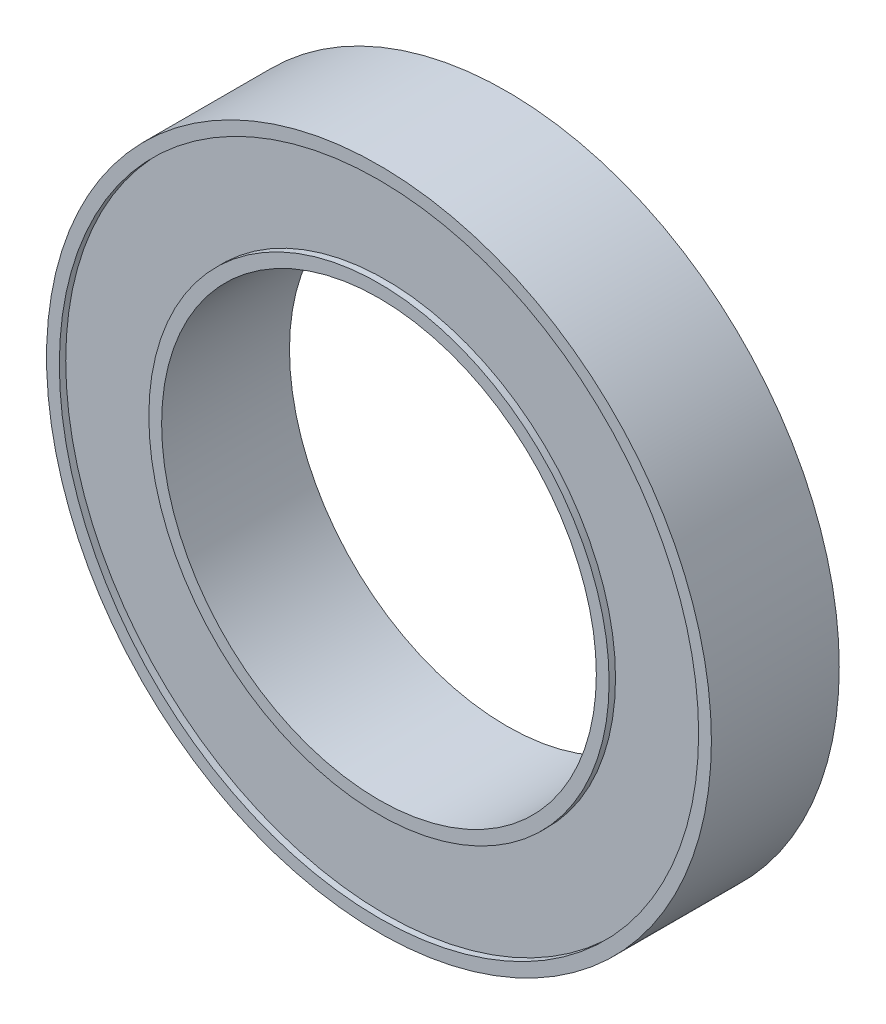
ISO-10303-21;
HEADER;
FILE_DESCRIPTION(('STEP AP214'),'2;1');
FILE_NAME('part.step','',(''),(''),'','','');
FILE_SCHEMA(('AUTOMOTIVE_DESIGN { 1 0 10303 214 1 1 1 1 }'));
ENDSEC;
DATA;
#1=APPLICATION_CONTEXT('core data for automotive mechanical design processes');
#2=APPLICATION_PROTOCOL_DEFINITION('international standard','automotive_design',2000,#1);
#3=PRODUCT_CONTEXT('',#1,'mechanical');
#4=PRODUCT('Part','Part','',(#3));
#5=PRODUCT_RELATED_PRODUCT_CATEGORY('part','',(#4));
#6=PRODUCT_DEFINITION_FORMATION('','',#4);
#7=PRODUCT_DEFINITION_CONTEXT('part definition',#1,'design');
#8=PRODUCT_DEFINITION('design','',#6,#7);
#9=PRODUCT_DEFINITION_SHAPE('','',#8);
#10=(LENGTH_UNIT() NAMED_UNIT(*) SI_UNIT(.MILLI.,.METRE.));
#11=(NAMED_UNIT(*) PLANE_ANGLE_UNIT() SI_UNIT($,.RADIAN.));
#12=(NAMED_UNIT(*) SI_UNIT($,.STERADIAN.) SOLID_ANGLE_UNIT());
#13=UNCERTAINTY_MEASURE_WITH_UNIT(LENGTH_MEASURE(1.E-05),#10,'distance_accuracy_value','');
#14=(GEOMETRIC_REPRESENTATION_CONTEXT(3) GLOBAL_UNCERTAINTY_ASSIGNED_CONTEXT((#13)) GLOBAL_UNIT_ASSIGNED_CONTEXT((#10,
#11,#12)) REPRESENTATION_CONTEXT('',''));
#15=CARTESIAN_POINT('',(0.,0.,0.));
#16=DIRECTION('',(0.,0.,1.));
#17=DIRECTION('',(1.,0.,0.));
#18=AXIS2_PLACEMENT_3D('',#15,#16,#17);
#19=CARTESIAN_POINT('',(0.,0.,-2.5));
#20=DIRECTION('',(0.,0.,1.));
#21=DIRECTION('',(1.,0.,0.));
#22=AXIS2_PLACEMENT_3D('',#19,#20,#21);
#23=PLANE('',#22);
#24=CARTESIAN_POINT('',(0.,0.,-2.5));
#25=DIRECTION('',(0.,0.,1.));
#26=DIRECTION('',(1.,0.,0.));
#27=AXIS2_PLACEMENT_3D('',#24,#25,#26);
#28=CIRCLE('',#27,8.5);
#29=CARTESIAN_POINT('',(8.5,0.,-2.5));
#30=VERTEX_POINT('',#29);
#31=EDGE_CURVE('E60',#30,#30,#28,.T.);
#32=ORIENTED_EDGE('',*,*,#31,.T.);
#33=EDGE_LOOP('',(#32));
#34=FACE_BOUND('',#33,.T.);
#35=CARTESIAN_POINT('',(0.,0.,-2.5));
#36=DIRECTION('',(0.,0.,1.));
#37=DIRECTION('',(1.,0.,0.));
#38=AXIS2_PLACEMENT_3D('',#35,#36,#37);
#39=CIRCLE('',#38,9.);
#40=CARTESIAN_POINT('',(9.,0.,-2.5));
#41=VERTEX_POINT('',#40);
#42=EDGE_CURVE('E84',#41,#41,#39,.T.);
#43=ORIENTED_EDGE('',*,*,#42,.F.);
#44=EDGE_LOOP('',(#43));
#45=FACE_BOUND('',#44,.T.);
#46=ADVANCED_FACE('F47',(#34,#45),#23,.F.);
#47=CARTESIAN_POINT('',(0.,0.,2.5));
#48=DIRECTION('',(0.,0.,1.));
#49=DIRECTION('',(1.,0.,0.));
#50=AXIS2_PLACEMENT_3D('',#47,#48,#49);
#51=PLANE('',#50);
#52=CARTESIAN_POINT('',(0.,0.,2.5));
#53=DIRECTION('',(0.,0.,1.));
#54=DIRECTION('',(1.,0.,0.));
#55=AXIS2_PLACEMENT_3D('',#52,#53,#54);
#56=CIRCLE('',#55,8.5);
#57=CARTESIAN_POINT('',(8.5,0.,2.5));
#58=VERTEX_POINT('',#57);
#59=EDGE_CURVE('E58',#58,#58,#56,.T.);
#60=ORIENTED_EDGE('',*,*,#59,.F.);
#61=EDGE_LOOP('',(#60));
#62=FACE_BOUND('',#61,.T.);
#63=CARTESIAN_POINT('',(0.,0.,2.5));
#64=DIRECTION('',(0.,0.,1.));
#65=DIRECTION('',(1.,0.,0.));
#66=AXIS2_PLACEMENT_3D('',#63,#64,#65);
#67=CIRCLE('',#66,9.);
#68=CARTESIAN_POINT('',(9.,0.,2.5));
#69=VERTEX_POINT('',#68);
#70=EDGE_CURVE('E72',#69,#69,#67,.T.);
#71=ORIENTED_EDGE('',*,*,#70,.T.);
#72=EDGE_LOOP('',(#71));
#73=FACE_BOUND('',#72,.T.);
#74=ADVANCED_FACE('F100',(#62,#73),#51,.T.);
#75=CARTESIAN_POINT('',(0.,0.,2.5));
#76=DIRECTION('',(0.,0.,1.));
#77=DIRECTION('',(1.,0.,0.));
#78=AXIS2_PLACEMENT_3D('',#75,#76,#77);
#79=CIRCLE('',#78,12.5);
#80=CARTESIAN_POINT('',(12.5,0.,2.5));
#81=VERTEX_POINT('',#80);
#82=EDGE_CURVE('E66',#81,#81,#79,.T.);
#83=ORIENTED_EDGE('',*,*,#82,.F.);
#84=EDGE_LOOP('',(#83));
#85=FACE_BOUND('',#84,.T.);
#86=CARTESIAN_POINT('',(0.,0.,2.5));
#87=DIRECTION('',(0.,0.,1.));
#88=DIRECTION('',(1.,0.,0.));
#89=AXIS2_PLACEMENT_3D('',#86,#87,#88);
#90=CIRCLE('',#89,13.);
#91=CARTESIAN_POINT('',(13.,0.,2.5));
#92=VERTEX_POINT('',#91);
#93=EDGE_CURVE('E11',#92,#92,#90,.T.);
#94=ORIENTED_EDGE('',*,*,#93,.T.);
#95=EDGE_LOOP('',(#94));
#96=FACE_BOUND('',#95,.T.);
#97=ADVANCED_FACE('F106',(#85,#96),#51,.T.);
#98=CARTESIAN_POINT('',(0.,0.,-2.5));
#99=DIRECTION('',(0.,0.,1.));
#100=DIRECTION('',(1.,0.,0.));
#101=AXIS2_PLACEMENT_3D('',#98,#99,#100);
#102=CIRCLE('',#101,12.5);
#103=CARTESIAN_POINT('',(12.5,0.,-2.5));
#104=VERTEX_POINT('',#103);
#105=EDGE_CURVE('E78',#104,#104,#102,.T.);
#106=ORIENTED_EDGE('',*,*,#105,.T.);
#107=EDGE_LOOP('',(#106));
#108=FACE_BOUND('',#107,.T.);
#109=CARTESIAN_POINT('',(0.,0.,-2.5));
#110=DIRECTION('',(0.,0.,1.));
#111=DIRECTION('',(1.,0.,0.));
#112=AXIS2_PLACEMENT_3D('',#109,#110,#111);
#113=CIRCLE('',#112,13.);
#114=CARTESIAN_POINT('',(13.,0.,-2.5));
#115=VERTEX_POINT('',#114);
#116=EDGE_CURVE('E51',#115,#115,#113,.T.);
#117=ORIENTED_EDGE('',*,*,#116,.F.);
#118=EDGE_LOOP('',(#117));
#119=FACE_BOUND('',#118,.T.);
#120=ADVANCED_FACE('F102',(#108,#119),#23,.F.);
#121=CARTESIAN_POINT('',(0.,0.,2.5));
#122=DIRECTION('',(0.,0.,-1.));
#123=DIRECTION('',(-1.,0.,0.));
#124=AXIS2_PLACEMENT_3D('',#121,#122,#123);
#125=CYLINDRICAL_SURFACE('',#124,13.);
#126=ORIENTED_EDGE('',*,*,#93,.F.);
#127=EDGE_LOOP('',(#126));
#128=FACE_BOUND('',#127,.T.);
#129=ORIENTED_EDGE('',*,*,#116,.T.);
#130=EDGE_LOOP('',(#129));
#131=FACE_BOUND('',#130,.T.);
#132=ADVANCED_FACE('F49',(#128,#131),#125,.T.);
#133=CARTESIAN_POINT('',(0.,0.,2.5));
#134=DIRECTION('',(0.,0.,-1.));
#135=DIRECTION('',(-1.,0.,0.));
#136=AXIS2_PLACEMENT_3D('',#133,#134,#135);
#137=CYLINDRICAL_SURFACE('',#136,8.5);
#138=ORIENTED_EDGE('',*,*,#59,.T.);
#139=EDGE_LOOP('',(#138));
#140=FACE_BOUND('',#139,.T.);
#141=ORIENTED_EDGE('',*,*,#31,.F.);
#142=EDGE_LOOP('',(#141));
#143=FACE_BOUND('',#142,.T.);
#144=ADVANCED_FACE('F115',(#140,#143),#137,.F.);
#145=CARTESIAN_POINT('',(0.,0.,2.25));
#146=DIRECTION('',(0.,0.,1.));
#147=DIRECTION('',(1.,0.,0.));
#148=AXIS2_PLACEMENT_3D('',#145,#146,#147);
#149=CYLINDRICAL_SURFACE('',#148,12.5);
#150=CARTESIAN_POINT('',(0.,0.,2.25));
#151=DIRECTION('',(0.,0.,1.));
#152=DIRECTION('',(1.,0.,0.));
#153=AXIS2_PLACEMENT_3D('',#150,#151,#152);
#154=CIRCLE('',#153,12.5);
#155=CARTESIAN_POINT('',(12.5,0.,2.25));
#156=VERTEX_POINT('',#155);
#157=EDGE_CURVE('E63',#156,#156,#154,.T.);
#158=ORIENTED_EDGE('',*,*,#157,.F.);
#159=EDGE_LOOP('',(#158));
#160=FACE_BOUND('',#159,.T.);
#161=ORIENTED_EDGE('',*,*,#82,.T.);
#162=EDGE_LOOP('',(#161));
#163=FACE_BOUND('',#162,.T.);
#164=ADVANCED_FACE('F139',(#160,#163),#149,.F.);
#165=CARTESIAN_POINT('',(0.,0.,2.25));
#166=DIRECTION('',(0.,0.,1.));
#167=DIRECTION('',(1.,0.,0.));
#168=AXIS2_PLACEMENT_3D('',#165,#166,#167);
#169=PLANE('',#168);
#170=CARTESIAN_POINT('',(0.,0.,2.25));
#171=DIRECTION('',(0.,0.,1.));
#172=DIRECTION('',(1.,0.,0.));
#173=AXIS2_PLACEMENT_3D('',#170,#171,#172);
#174=CIRCLE('',#173,9.);
#175=CARTESIAN_POINT('',(9.,0.,2.25));
#176=VERTEX_POINT('',#175);
#177=EDGE_CURVE('E69',#176,#176,#174,.T.);
#178=ORIENTED_EDGE('',*,*,#177,.F.);
#179=EDGE_LOOP('',(#178));
#180=FACE_BOUND('',#179,.T.);
#181=ORIENTED_EDGE('',*,*,#157,.T.);
#182=EDGE_LOOP('',(#181));
#183=FACE_BOUND('',#182,.T.);
#184=ADVANCED_FACE('F135',(#180,#183),#169,.T.);
#185=CARTESIAN_POINT('',(0.,0.,2.25));
#186=DIRECTION('',(0.,0.,1.));
#187=DIRECTION('',(1.,0.,0.));
#188=AXIS2_PLACEMENT_3D('',#185,#186,#187);
#189=CYLINDRICAL_SURFACE('',#188,9.);
#190=ORIENTED_EDGE('',*,*,#177,.T.);
#191=EDGE_LOOP('',(#190));
#192=FACE_BOUND('',#191,.T.);
#193=ORIENTED_EDGE('',*,*,#70,.F.);
#194=EDGE_LOOP('',(#193));
#195=FACE_BOUND('',#194,.T.);
#196=ADVANCED_FACE('F129',(#192,#195),#189,.T.);
#197=CARTESIAN_POINT('',(0.,0.,-2.25));
#198=DIRECTION('',(0.,0.,-1.));
#199=DIRECTION('',(1.,0.,0.));
#200=AXIS2_PLACEMENT_3D('',#197,#198,#199);
#201=PLANE('',#200);
#202=CARTESIAN_POINT('',(0.,0.,-2.25));
#203=DIRECTION('',(0.,0.,1.));
#204=DIRECTION('',(1.,0.,0.));
#205=AXIS2_PLACEMENT_3D('',#202,#203,#204);
#206=CIRCLE('',#205,12.5);
#207=CARTESIAN_POINT('',(12.5,0.,-2.25));
#208=VERTEX_POINT('',#207);
#209=EDGE_CURVE('E75',#208,#208,#206,.T.);
#210=ORIENTED_EDGE('',*,*,#209,.F.);
#211=EDGE_LOOP('',(#210));
#212=FACE_BOUND('',#211,.T.);
#213=CARTESIAN_POINT('',(0.,0.,-2.25));
#214=DIRECTION('',(0.,0.,1.));
#215=DIRECTION('',(1.,0.,0.));
#216=AXIS2_PLACEMENT_3D('',#213,#214,#215);
#217=CIRCLE('',#216,9.);
#218=CARTESIAN_POINT('',(9.,0.,-2.25));
#219=VERTEX_POINT('',#218);
#220=EDGE_CURVE('E81',#219,#219,#217,.T.);
#221=ORIENTED_EDGE('',*,*,#220,.T.);
#222=EDGE_LOOP('',(#221));
#223=FACE_BOUND('',#222,.T.);
#224=ADVANCED_FACE('F90',(#212,#223),#201,.T.);
#225=CARTESIAN_POINT('',(0.,0.,-2.25));
#226=DIRECTION('',(0.,0.,-1.));
#227=DIRECTION('',(-1.,0.,0.));
#228=AXIS2_PLACEMENT_3D('',#225,#226,#227);
#229=CYLINDRICAL_SURFACE('',#228,12.5);
#230=ORIENTED_EDGE('',*,*,#209,.T.);
#231=EDGE_LOOP('',(#230));
#232=FACE_BOUND('',#231,.T.);
#233=ORIENTED_EDGE('',*,*,#105,.F.);
#234=EDGE_LOOP('',(#233));
#235=FACE_BOUND('',#234,.T.);
#236=ADVANCED_FACE('F95',(#232,#235),#229,.F.);
#237=CARTESIAN_POINT('',(0.,0.,-2.25));
#238=DIRECTION('',(0.,0.,-1.));
#239=DIRECTION('',(-1.,0.,0.));
#240=AXIS2_PLACEMENT_3D('',#237,#238,#239);
#241=CYLINDRICAL_SURFACE('',#240,9.);
#242=ORIENTED_EDGE('',*,*,#220,.F.);
#243=EDGE_LOOP('',(#242));
#244=FACE_BOUND('',#243,.T.);
#245=ORIENTED_EDGE('',*,*,#42,.T.);
#246=EDGE_LOOP('',(#245));
#247=FACE_BOUND('',#246,.T.);
#248=ADVANCED_FACE('F92',(#244,#247),#241,.T.);
#249=CLOSED_SHELL('',(#46,#74,#97,#120,#132,#144,#164,#184,#196,#224,#236,#248));
#250=MANIFOLD_SOLID_BREP('B2',#249);
#251=ADVANCED_BREP_SHAPE_REPRESENTATION('',(#18,#250),#14);
#252=SHAPE_DEFINITION_REPRESENTATION(#9,#251);
ENDSEC;
END-ISO-10303-21;
